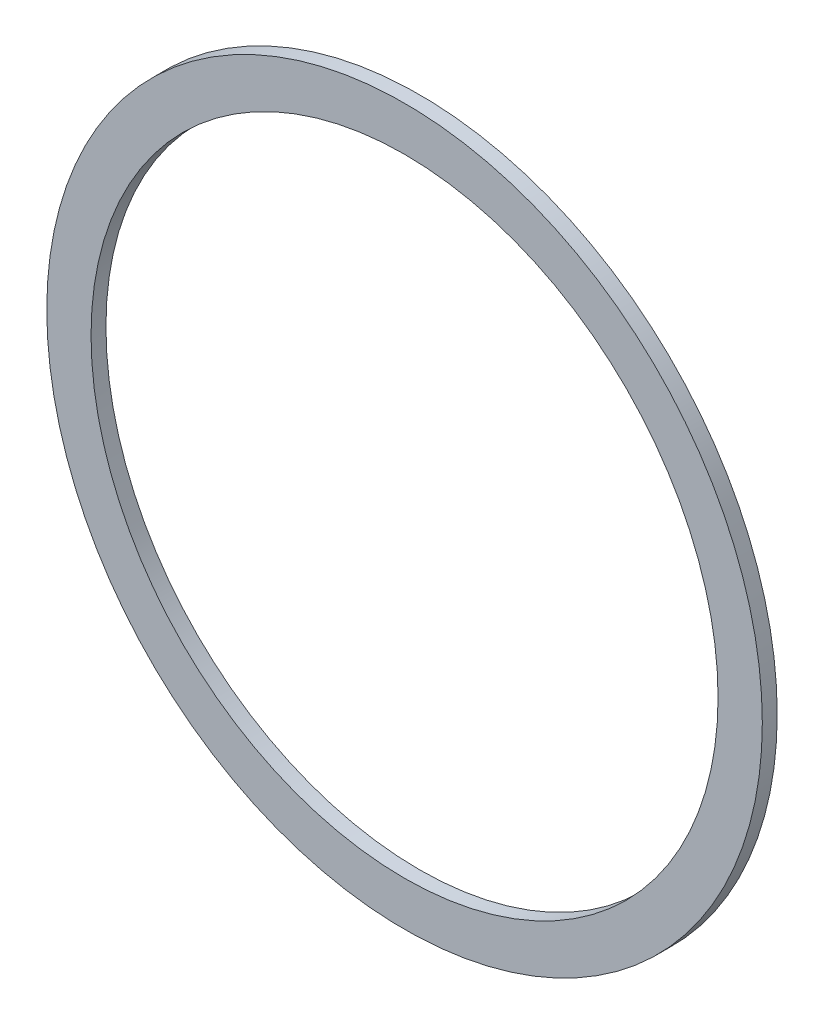
ISO-10303-21;
HEADER;
FILE_DESCRIPTION(('STEP AP214'),'2;1');
FILE_NAME('part.step','',(''),(''),'','','');
FILE_SCHEMA(('AUTOMOTIVE_DESIGN { 1 0 10303 214 1 1 1 1 }'));
ENDSEC;
DATA;
#1=APPLICATION_CONTEXT('core data for automotive mechanical design processes');
#2=APPLICATION_PROTOCOL_DEFINITION('international standard','automotive_design',2000,#1);
#3=PRODUCT_CONTEXT('',#1,'mechanical');
#4=PRODUCT('Part','Part','',(#3));
#5=PRODUCT_RELATED_PRODUCT_CATEGORY('part','',(#4));
#6=PRODUCT_DEFINITION_FORMATION('','',#4);
#7=PRODUCT_DEFINITION_CONTEXT('part definition',#1,'design');
#8=PRODUCT_DEFINITION('design','',#6,#7);
#9=PRODUCT_DEFINITION_SHAPE('','',#8);
#10=(LENGTH_UNIT() NAMED_UNIT(*) SI_UNIT(.MILLI.,.METRE.));
#11=(NAMED_UNIT(*) PLANE_ANGLE_UNIT() SI_UNIT($,.RADIAN.));
#12=(NAMED_UNIT(*) SI_UNIT($,.STERADIAN.) SOLID_ANGLE_UNIT());
#13=UNCERTAINTY_MEASURE_WITH_UNIT(LENGTH_MEASURE(1.E-05),#10,'distance_accuracy_value','');
#14=(GEOMETRIC_REPRESENTATION_CONTEXT(3) GLOBAL_UNCERTAINTY_ASSIGNED_CONTEXT((#13)) GLOBAL_UNIT_ASSIGNED_CONTEXT((#10,
#11,#12)) REPRESENTATION_CONTEXT('',''));
#15=CARTESIAN_POINT('',(0.,0.,0.));
#16=DIRECTION('',(0.,0.,1.));
#17=DIRECTION('',(1.,0.,0.));
#18=AXIS2_PLACEMENT_3D('',#15,#16,#17);
#19=CARTESIAN_POINT('',(0.,0.,-25.654));
#20=DIRECTION('',(0.,0.,1.));
#21=DIRECTION('',(1.,0.,0.));
#22=AXIS2_PLACEMENT_3D('',#19,#20,#21);
#23=CYLINDRICAL_SURFACE('',#22,615.95);
#24=CARTESIAN_POINT('',(0.,0.,-25.654));
#25=DIRECTION('',(0.,0.,1.));
#26=DIRECTION('',(1.,0.,0.));
#27=AXIS2_PLACEMENT_3D('',#24,#25,#26);
#28=CIRCLE('',#27,615.95);
#29=CARTESIAN_POINT('',(615.95,0.,-25.654));
#30=VERTEX_POINT('',#29);
#31=EDGE_CURVE('E10',#30,#30,#28,.T.);
#32=ORIENTED_EDGE('',*,*,#31,.T.);
#33=EDGE_LOOP('',(#32));
#34=FACE_BOUND('',#33,.T.);
#35=CARTESIAN_POINT('',(0.,0.,0.));
#36=DIRECTION('',(0.,0.,1.));
#37=DIRECTION('',(1.,0.,0.));
#38=AXIS2_PLACEMENT_3D('',#35,#36,#37);
#39=CIRCLE('',#38,615.95);
#40=CARTESIAN_POINT('',(615.95,0.,0.));
#41=VERTEX_POINT('',#40);
#42=EDGE_CURVE('E40',#41,#41,#39,.T.);
#43=ORIENTED_EDGE('',*,*,#42,.F.);
#44=EDGE_LOOP('',(#43));
#45=FACE_BOUND('',#44,.T.);
#46=ADVANCED_FACE('F37',(#34,#45),#23,.T.);
#47=CARTESIAN_POINT('',(0.,0.,-25.654));
#48=DIRECTION('',(0.,0.,1.));
#49=DIRECTION('',(1.,0.,0.));
#50=AXIS2_PLACEMENT_3D('',#47,#48,#49);
#51=PLANE('',#50);
#52=CARTESIAN_POINT('',(0.,0.,-25.654));
#53=DIRECTION('',(0.,0.,1.));
#54=DIRECTION('',(1.,0.,0.));
#55=AXIS2_PLACEMENT_3D('',#52,#53,#54);
#56=CIRCLE('',#55,539.75);
#57=CARTESIAN_POINT('',(539.75,0.,-25.654));
#58=VERTEX_POINT('',#57);
#59=EDGE_CURVE('E47',#58,#58,#56,.T.);
#60=ORIENTED_EDGE('',*,*,#59,.T.);
#61=EDGE_LOOP('',(#60));
#62=FACE_BOUND('',#61,.T.);
#63=ORIENTED_EDGE('',*,*,#31,.F.);
#64=EDGE_LOOP('',(#63));
#65=FACE_BOUND('',#64,.T.);
#66=ADVANCED_FACE('F55',(#62,#65),#51,.F.);
#67=CARTESIAN_POINT('',(0.,0.,0.));
#68=DIRECTION('',(0.,0.,1.));
#69=DIRECTION('',(1.,0.,0.));
#70=AXIS2_PLACEMENT_3D('',#67,#68,#69);
#71=PLANE('',#70);
#72=CARTESIAN_POINT('',(0.,0.,0.));
#73=DIRECTION('',(0.,0.,1.));
#74=DIRECTION('',(1.,0.,0.));
#75=AXIS2_PLACEMENT_3D('',#72,#73,#74);
#76=CIRCLE('',#75,539.75);
#77=CARTESIAN_POINT('',(539.75,0.,0.));
#78=VERTEX_POINT('',#77);
#79=EDGE_CURVE('E49',#78,#78,#76,.T.);
#80=ORIENTED_EDGE('',*,*,#79,.F.);
#81=EDGE_LOOP('',(#80));
#82=FACE_BOUND('',#81,.T.);
#83=ORIENTED_EDGE('',*,*,#42,.T.);
#84=EDGE_LOOP('',(#83));
#85=FACE_BOUND('',#84,.T.);
#86=ADVANCED_FACE('F61',(#82,#85),#71,.T.);
#87=CARTESIAN_POINT('',(0.,0.,-25.654));
#88=DIRECTION('',(0.,0.,1.));
#89=DIRECTION('',(1.,0.,0.));
#90=AXIS2_PLACEMENT_3D('',#87,#88,#89);
#91=CYLINDRICAL_SURFACE('',#90,539.75);
#92=ORIENTED_EDGE('',*,*,#59,.F.);
#93=EDGE_LOOP('',(#92));
#94=FACE_BOUND('',#93,.T.);
#95=ORIENTED_EDGE('',*,*,#79,.T.);
#96=EDGE_LOOP('',(#95));
#97=FACE_BOUND('',#96,.T.);
#98=ADVANCED_FACE('F58',(#94,#97),#91,.F.);
#99=CLOSED_SHELL('',(#46,#66,#86,#98));
#100=MANIFOLD_SOLID_BREP('B2',#99);
#101=ADVANCED_BREP_SHAPE_REPRESENTATION('',(#18,#100),#14);
#102=SHAPE_DEFINITION_REPRESENTATION(#9,#101);
ENDSEC;
END-ISO-10303-21;
